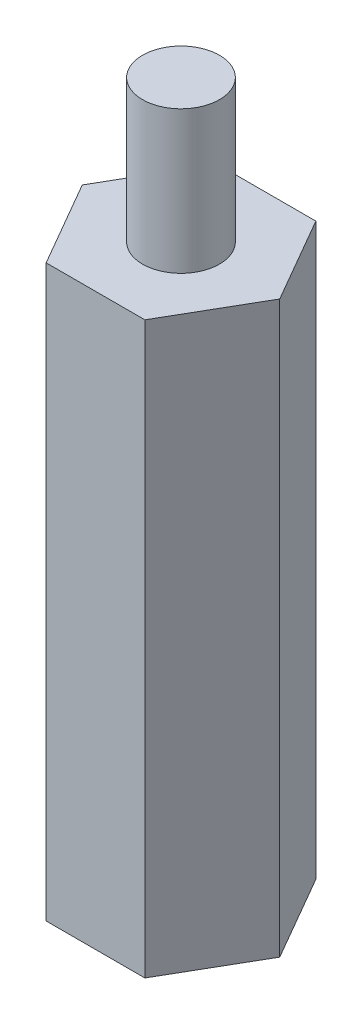
ISO-10303-21;
HEADER;
FILE_DESCRIPTION(('STEP AP214'),'2;1');
FILE_NAME('part.step','',(''),(''),'','','');
FILE_SCHEMA(('AUTOMOTIVE_DESIGN { 1 0 10303 214 1 1 1 1 }'));
ENDSEC;
DATA;
#1=APPLICATION_CONTEXT('core data for automotive mechanical design processes');
#2=APPLICATION_PROTOCOL_DEFINITION('international standard','automotive_design',2000,#1);
#3=PRODUCT_CONTEXT('',#1,'mechanical');
#4=PRODUCT('Part','Part','',(#3));
#5=PRODUCT_RELATED_PRODUCT_CATEGORY('part','',(#4));
#6=PRODUCT_DEFINITION_FORMATION('','',#4);
#7=PRODUCT_DEFINITION_CONTEXT('part definition',#1,'design');
#8=PRODUCT_DEFINITION('design','',#6,#7);
#9=PRODUCT_DEFINITION_SHAPE('','',#8);
#10=(LENGTH_UNIT() NAMED_UNIT(*) SI_UNIT(.MILLI.,.METRE.));
#11=(NAMED_UNIT(*) PLANE_ANGLE_UNIT() SI_UNIT($,.RADIAN.));
#12=(NAMED_UNIT(*) SI_UNIT($,.STERADIAN.) SOLID_ANGLE_UNIT());
#13=UNCERTAINTY_MEASURE_WITH_UNIT(LENGTH_MEASURE(1.E-05),#10,'distance_accuracy_value','');
#14=(GEOMETRIC_REPRESENTATION_CONTEXT(3) GLOBAL_UNCERTAINTY_ASSIGNED_CONTEXT((#13)) GLOBAL_UNIT_ASSIGNED_CONTEXT((#10,
#11,#12)) REPRESENTATION_CONTEXT('',''));
#15=CARTESIAN_POINT('',(0.,0.,0.));
#16=DIRECTION('',(0.,0.,1.));
#17=DIRECTION('',(1.,0.,0.));
#18=AXIS2_PLACEMENT_3D('',#15,#16,#17);
#19=CARTESIAN_POINT('',(1.73205080756891,20.,2.99999999999998));
#20=DIRECTION('',(-0.866025403784442,0.,-0.499999999999995));
#21=DIRECTION('',(-0.499999999999995,0.,0.866025403784442));
#22=AXIS2_PLACEMENT_3D('',#19,#20,#21);
#23=PLANE('',#22);
#24=DIRECTION('',(0.499999999999995,0.,-0.866025403784442));
#25=VECTOR('',#24,1.);
#26=CARTESIAN_POINT('',(1.73205080756891,0.,2.99999999999998));
#27=LINE('',#26,#25);
#28=CARTESIAN_POINT('',(1.73205080756891,0.,2.99999999999998));
#29=VERTEX_POINT('',#28);
#30=CARTESIAN_POINT('',(3.46410161513776,0.,0.));
#31=VERTEX_POINT('',#30);
#32=EDGE_CURVE('E130',#29,#31,#27,.T.);
#33=ORIENTED_EDGE('',*,*,#32,.T.);
#34=DIRECTION('',(0.,-1.,0.));
#35=VECTOR('',#34,1.);
#36=CARTESIAN_POINT('',(3.46410161513776,20.,0.));
#37=LINE('',#36,#35);
#38=CARTESIAN_POINT('',(3.46410161513776,20.,0.));
#39=VERTEX_POINT('',#38);
#40=EDGE_CURVE('E42',#39,#31,#37,.T.);
#41=ORIENTED_EDGE('',*,*,#40,.F.);
#42=DIRECTION('',(0.499999999999995,0.,-0.866025403784442));
#43=VECTOR('',#42,1.);
#44=CARTESIAN_POINT('',(1.73205080756891,20.,2.99999999999998));
#45=LINE('',#44,#43);
#46=CARTESIAN_POINT('',(1.73205080756891,20.,2.99999999999998));
#47=VERTEX_POINT('',#46);
#48=EDGE_CURVE('E147',#47,#39,#45,.T.);
#49=ORIENTED_EDGE('',*,*,#48,.F.);
#50=DIRECTION('',(0.,-1.,0.));
#51=VECTOR('',#50,1.);
#52=CARTESIAN_POINT('',(1.73205080756891,20.,2.99999999999998));
#53=LINE('',#52,#51);
#54=EDGE_CURVE('E126',#47,#29,#53,.T.);
#55=ORIENTED_EDGE('',*,*,#54,.T.);
#56=EDGE_LOOP('',(#33,#41,#49,#55));
#57=FACE_BOUND('',#56,.T.);
#58=ADVANCED_FACE('F39',(#57),#23,.F.);
#59=CARTESIAN_POINT('',(3.46410161513776,20.,0.));
#60=DIRECTION('',(-0.866025403784438,0.,0.500000000000001));
#61=DIRECTION('',(0.500000000000001,0.,0.866025403784438));
#62=AXIS2_PLACEMENT_3D('',#59,#60,#61);
#63=PLANE('',#62);
#64=DIRECTION('',(-0.500000000000001,0.,-0.866025403784438));
#65=VECTOR('',#64,1.);
#66=CARTESIAN_POINT('',(3.46410161513776,0.,0.));
#67=LINE('',#66,#65);
#68=CARTESIAN_POINT('',(1.73205080756887,0.,-3.00000000000001));
#69=VERTEX_POINT('',#68);
#70=EDGE_CURVE('E134',#31,#69,#67,.T.);
#71=ORIENTED_EDGE('',*,*,#70,.T.);
#72=DIRECTION('',(0.,-1.,0.));
#73=VECTOR('',#72,1.);
#74=CARTESIAN_POINT('',(1.73205080756887,20.,-3.00000000000001));
#75=LINE('',#74,#73);
#76=CARTESIAN_POINT('',(1.73205080756887,20.,-3.00000000000001));
#77=VERTEX_POINT('',#76);
#78=EDGE_CURVE('E153',#77,#69,#75,.T.);
#79=ORIENTED_EDGE('',*,*,#78,.F.);
#80=DIRECTION('',(-0.500000000000001,0.,-0.866025403784438));
#81=VECTOR('',#80,1.);
#82=CARTESIAN_POINT('',(3.46410161513776,20.,0.));
#83=LINE('',#82,#81);
#84=EDGE_CURVE('E95',#39,#77,#83,.T.);
#85=ORIENTED_EDGE('',*,*,#84,.F.);
#86=ORIENTED_EDGE('',*,*,#40,.T.);
#87=EDGE_LOOP('',(#71,#79,#85,#86));
#88=FACE_BOUND('',#87,.T.);
#89=ADVANCED_FACE('F160',(#88),#63,.F.);
#90=CARTESIAN_POINT('',(1.73205080756887,20.,-3.00000000000001));
#91=DIRECTION('',(0.,0.,1.));
#92=DIRECTION('',(1.,0.,0.));
#93=AXIS2_PLACEMENT_3D('',#90,#91,#92);
#94=PLANE('',#93);
#95=DIRECTION('',(-1.,0.,0.));
#96=VECTOR('',#95,1.);
#97=CARTESIAN_POINT('',(1.73205080756887,0.,-3.00000000000001));
#98=LINE('',#97,#96);
#99=CARTESIAN_POINT('',(-1.73205080756889,0.,-2.99999999999999));
#100=VERTEX_POINT('',#99);
#101=EDGE_CURVE('E138',#69,#100,#98,.T.);
#102=ORIENTED_EDGE('',*,*,#101,.T.);
#103=DIRECTION('',(0.,-1.,0.));
#104=VECTOR('',#103,1.);
#105=CARTESIAN_POINT('',(-1.73205080756889,20.,-2.99999999999999));
#106=LINE('',#105,#104);
#107=CARTESIAN_POINT('',(-1.73205080756889,20.,-2.99999999999999));
#108=VERTEX_POINT('',#107);
#109=EDGE_CURVE('E119',#108,#100,#106,.T.);
#110=ORIENTED_EDGE('',*,*,#109,.F.);
#111=DIRECTION('',(-1.,0.,0.));
#112=VECTOR('',#111,1.);
#113=CARTESIAN_POINT('',(1.73205080756887,20.,-3.00000000000001));
#114=LINE('',#113,#112);
#115=EDGE_CURVE('E108',#77,#108,#114,.T.);
#116=ORIENTED_EDGE('',*,*,#115,.F.);
#117=ORIENTED_EDGE('',*,*,#78,.T.);
#118=EDGE_LOOP('',(#102,#110,#116,#117));
#119=FACE_BOUND('',#118,.T.);
#120=ADVANCED_FACE('F166',(#119),#94,.F.);
#121=CARTESIAN_POINT('',(-1.73205080756889,20.,-2.99999999999999));
#122=DIRECTION('',(0.866025403784442,0.,0.499999999999995));
#123=DIRECTION('',(0.499999999999995,0.,-0.866025403784442));
#124=AXIS2_PLACEMENT_3D('',#121,#122,#123);
#125=PLANE('',#124);
#126=DIRECTION('',(-0.499999999999995,0.,0.866025403784442));
#127=VECTOR('',#126,1.);
#128=CARTESIAN_POINT('',(-1.73205080756889,0.,-2.99999999999999));
#129=LINE('',#128,#127);
#130=CARTESIAN_POINT('',(-3.46410161513776,0.,0.));
#131=VERTEX_POINT('',#130);
#132=EDGE_CURVE('E117',#100,#131,#129,.T.);
#133=ORIENTED_EDGE('',*,*,#132,.T.);
#134=DIRECTION('',(0.,-1.,0.));
#135=VECTOR('',#134,1.);
#136=CARTESIAN_POINT('',(-3.46410161513776,20.,0.));
#137=LINE('',#136,#135);
#138=CARTESIAN_POINT('',(-3.46410161513776,20.,0.));
#139=VERTEX_POINT('',#138);
#140=EDGE_CURVE('E114',#139,#131,#137,.T.);
#141=ORIENTED_EDGE('',*,*,#140,.F.);
#142=DIRECTION('',(-0.499999999999995,0.,0.866025403784442));
#143=VECTOR('',#142,1.);
#144=CARTESIAN_POINT('',(-1.73205080756889,20.,-2.99999999999999));
#145=LINE('',#144,#143);
#146=EDGE_CURVE('E102',#108,#139,#145,.T.);
#147=ORIENTED_EDGE('',*,*,#146,.F.);
#148=ORIENTED_EDGE('',*,*,#109,.T.);
#149=EDGE_LOOP('',(#133,#141,#147,#148));
#150=FACE_BOUND('',#149,.T.);
#151=ADVANCED_FACE('F115',(#150),#125,.F.);
#152=CARTESIAN_POINT('',(-3.46410161513776,20.,0.));
#153=DIRECTION('',(0.866025403784435,0.,-0.500000000000007));
#154=DIRECTION('',(-0.500000000000007,0.,-0.866025403784435));
#155=AXIS2_PLACEMENT_3D('',#152,#153,#154);
#156=PLANE('',#155);
#157=DIRECTION('',(0.500000000000007,0.,0.866025403784434));
#158=VECTOR('',#157,1.);
#159=CARTESIAN_POINT('',(-3.46410161513776,0.,0.));
#160=LINE('',#159,#158);
#161=CARTESIAN_POINT('',(-1.73205080756885,0.,3.00000000000002));
#162=VERTEX_POINT('',#161);
#163=EDGE_CURVE('E80',#131,#162,#160,.T.);
#164=ORIENTED_EDGE('',*,*,#163,.T.);
#165=DIRECTION('',(0.,-1.,0.));
#166=VECTOR('',#165,1.);
#167=CARTESIAN_POINT('',(-1.73205080756885,20.,3.00000000000002));
#168=LINE('',#167,#166);
#169=CARTESIAN_POINT('',(-1.73205080756885,20.,3.00000000000002));
#170=VERTEX_POINT('',#169);
#171=EDGE_CURVE('E120',#170,#162,#168,.T.);
#172=ORIENTED_EDGE('',*,*,#171,.F.);
#173=DIRECTION('',(0.500000000000007,0.,0.866025403784434));
#174=VECTOR('',#173,1.);
#175=CARTESIAN_POINT('',(-3.46410161513776,20.,0.));
#176=LINE('',#175,#174);
#177=EDGE_CURVE('E106',#139,#170,#176,.T.);
#178=ORIENTED_EDGE('',*,*,#177,.F.);
#179=ORIENTED_EDGE('',*,*,#140,.T.);
#180=EDGE_LOOP('',(#164,#172,#178,#179));
#181=FACE_BOUND('',#180,.T.);
#182=ADVANCED_FACE('F122',(#181),#156,.F.);
#183=CARTESIAN_POINT('',(-1.73205080756885,20.,3.00000000000002));
#184=DIRECTION('',(0.,0.,-1.));
#185=DIRECTION('',(-1.,0.,0.));
#186=AXIS2_PLACEMENT_3D('',#183,#184,#185);
#187=PLANE('',#186);
#188=DIRECTION('',(1.,0.,0.));
#189=VECTOR('',#188,1.);
#190=CARTESIAN_POINT('',(-1.73205080756885,0.,3.00000000000002));
#191=LINE('',#190,#189);
#192=EDGE_CURVE('E86',#162,#29,#191,.T.);
#193=ORIENTED_EDGE('',*,*,#192,.T.);
#194=ORIENTED_EDGE('',*,*,#54,.F.);
#195=DIRECTION('',(1.,0.,0.));
#196=VECTOR('',#195,1.);
#197=CARTESIAN_POINT('',(-1.73205080756885,20.,3.00000000000002));
#198=LINE('',#197,#196);
#199=EDGE_CURVE('E57',#170,#47,#198,.T.);
#200=ORIENTED_EDGE('',*,*,#199,.F.);
#201=ORIENTED_EDGE('',*,*,#171,.T.);
#202=EDGE_LOOP('',(#193,#194,#200,#201));
#203=FACE_BOUND('',#202,.T.);
#204=ADVANCED_FACE('F203',(#203),#187,.F.);
#205=CARTESIAN_POINT('',(0.,20.,0.));
#206=DIRECTION('',(0.,1.,0.));
#207=DIRECTION('',(0.,0.,1.));
#208=AXIS2_PLACEMENT_3D('',#205,#206,#207);
#209=PLANE('',#208);
#210=CARTESIAN_POINT('',(0.,20.,0.));
#211=DIRECTION('',(0.,1.,0.));
#212=DIRECTION('',(0.,0.,1.));
#213=AXIS2_PLACEMENT_3D('',#210,#211,#212);
#214=CIRCLE('',#213,1.35);
#215=CARTESIAN_POINT('',(0.,20.,1.35));
#216=VERTEX_POINT('',#215);
#217=EDGE_CURVE('E11',#216,#216,#214,.T.);
#218=ORIENTED_EDGE('',*,*,#217,.F.);
#219=EDGE_LOOP('',(#218));
#220=FACE_BOUND('',#219,.T.);
#221=ORIENTED_EDGE('',*,*,#48,.T.);
#222=ORIENTED_EDGE('',*,*,#84,.T.);
#223=ORIENTED_EDGE('',*,*,#115,.T.);
#224=ORIENTED_EDGE('',*,*,#146,.T.);
#225=ORIENTED_EDGE('',*,*,#177,.T.);
#226=ORIENTED_EDGE('',*,*,#199,.T.);
#227=EDGE_LOOP('',(#221,#222,#223,#224,#225,#226));
#228=FACE_BOUND('',#227,.T.);
#229=ADVANCED_FACE('F104',(#220,#228),#209,.T.);
#230=CARTESIAN_POINT('',(0.,0.,0.));
#231=DIRECTION('',(0.,1.,0.));
#232=DIRECTION('',(0.,0.,1.));
#233=AXIS2_PLACEMENT_3D('',#230,#231,#232);
#234=PLANE('',#233);
#235=CARTESIAN_POINT('',(0.,0.,0.));
#236=DIRECTION('',(0.,-1.,0.));
#237=DIRECTION('',(0.,0.,-1.));
#238=AXIS2_PLACEMENT_3D('',#235,#236,#237);
#239=CIRCLE('',#238,1.35);
#240=CARTESIAN_POINT('',(0.,0.,-1.35));
#241=VERTEX_POINT('',#240);
#242=EDGE_CURVE('E177',#241,#241,#239,.T.);
#243=ORIENTED_EDGE('',*,*,#242,.F.);
#244=EDGE_LOOP('',(#243));
#245=FACE_BOUND('',#244,.T.);
#246=ORIENTED_EDGE('',*,*,#32,.F.);
#247=ORIENTED_EDGE('',*,*,#192,.F.);
#248=ORIENTED_EDGE('',*,*,#163,.F.);
#249=ORIENTED_EDGE('',*,*,#132,.F.);
#250=ORIENTED_EDGE('',*,*,#101,.F.);
#251=ORIENTED_EDGE('',*,*,#70,.F.);
#252=EDGE_LOOP('',(#246,#247,#248,#249,#250,#251));
#253=FACE_BOUND('',#252,.T.);
#254=ADVANCED_FACE('F165',(#245,#253),#234,.F.);
#255=CARTESIAN_POINT('',(0.,25.,0.));
#256=DIRECTION('',(0.,-1.,0.));
#257=DIRECTION('',(0.,0.,-1.));
#258=AXIS2_PLACEMENT_3D('',#255,#256,#257);
#259=CYLINDRICAL_SURFACE('',#258,1.35);
#260=CARTESIAN_POINT('',(0.,25.,0.));
#261=DIRECTION('',(0.,1.,0.));
#262=DIRECTION('',(0.,0.,1.));
#263=AXIS2_PLACEMENT_3D('',#260,#261,#262);
#264=CIRCLE('',#263,1.35);
#265=CARTESIAN_POINT('',(0.,25.,1.35));
#266=VERTEX_POINT('',#265);
#267=EDGE_CURVE('E135',#266,#266,#264,.T.);
#268=ORIENTED_EDGE('',*,*,#267,.F.);
#269=EDGE_LOOP('',(#268));
#270=FACE_BOUND('',#269,.T.);
#271=ORIENTED_EDGE('',*,*,#217,.T.);
#272=EDGE_LOOP('',(#271));
#273=FACE_BOUND('',#272,.T.);
#274=ADVANCED_FACE('F195',(#270,#273),#259,.T.);
#275=CARTESIAN_POINT('',(0.,25.,0.));
#276=DIRECTION('',(0.,1.,0.));
#277=DIRECTION('',(0.,0.,1.));
#278=AXIS2_PLACEMENT_3D('',#275,#276,#277);
#279=PLANE('',#278);
#280=ORIENTED_EDGE('',*,*,#267,.T.);
#281=EDGE_LOOP('',(#280));
#282=FACE_BOUND('',#281,.T.);
#283=ADVANCED_FACE('F190',(#282),#279,.T.);
#284=CARTESIAN_POINT('',(0.,4.,0.));
#285=DIRECTION('',(0.,-1.,0.));
#286=DIRECTION('',(0.,0.,-1.));
#287=AXIS2_PLACEMENT_3D('',#284,#285,#286);
#288=CYLINDRICAL_SURFACE('',#287,1.35);
#289=CARTESIAN_POINT('',(0.,4.,0.));
#290=DIRECTION('',(0.,-1.,0.));
#291=DIRECTION('',(0.,0.,-1.));
#292=AXIS2_PLACEMENT_3D('',#289,#290,#291);
#293=CIRCLE('',#292,1.35);
#294=CARTESIAN_POINT('',(0.,4.,-1.35));
#295=VERTEX_POINT('',#294);
#296=EDGE_CURVE('E176',#295,#295,#293,.T.);
#297=ORIENTED_EDGE('',*,*,#296,.F.);
#298=EDGE_LOOP('',(#297));
#299=FACE_BOUND('',#298,.T.);
#300=ORIENTED_EDGE('',*,*,#242,.T.);
#301=EDGE_LOOP('',(#300));
#302=FACE_BOUND('',#301,.T.);
#303=ADVANCED_FACE('F187',(#299,#302),#288,.F.);
#304=CARTESIAN_POINT('',(0.,4.,0.));
#305=DIRECTION('',(0.,-1.,0.));
#306=DIRECTION('',(0.,0.,-1.));
#307=AXIS2_PLACEMENT_3D('',#304,#305,#306);
#308=PLANE('',#307);
#309=ORIENTED_EDGE('',*,*,#296,.T.);
#310=EDGE_LOOP('',(#309));
#311=FACE_BOUND('',#310,.T.);
#312=ADVANCED_FACE('F185',(#311),#308,.T.);
#313=CLOSED_SHELL('',(#58,#89,#120,#151,#182,#204,#229,#254,#274,#283,#303,#312));
#314=MANIFOLD_SOLID_BREP('B2',#313);
#315=ADVANCED_BREP_SHAPE_REPRESENTATION('',(#18,#314),#14);
#316=SHAPE_DEFINITION_REPRESENTATION(#9,#315);
ENDSEC;
END-ISO-10303-21;
